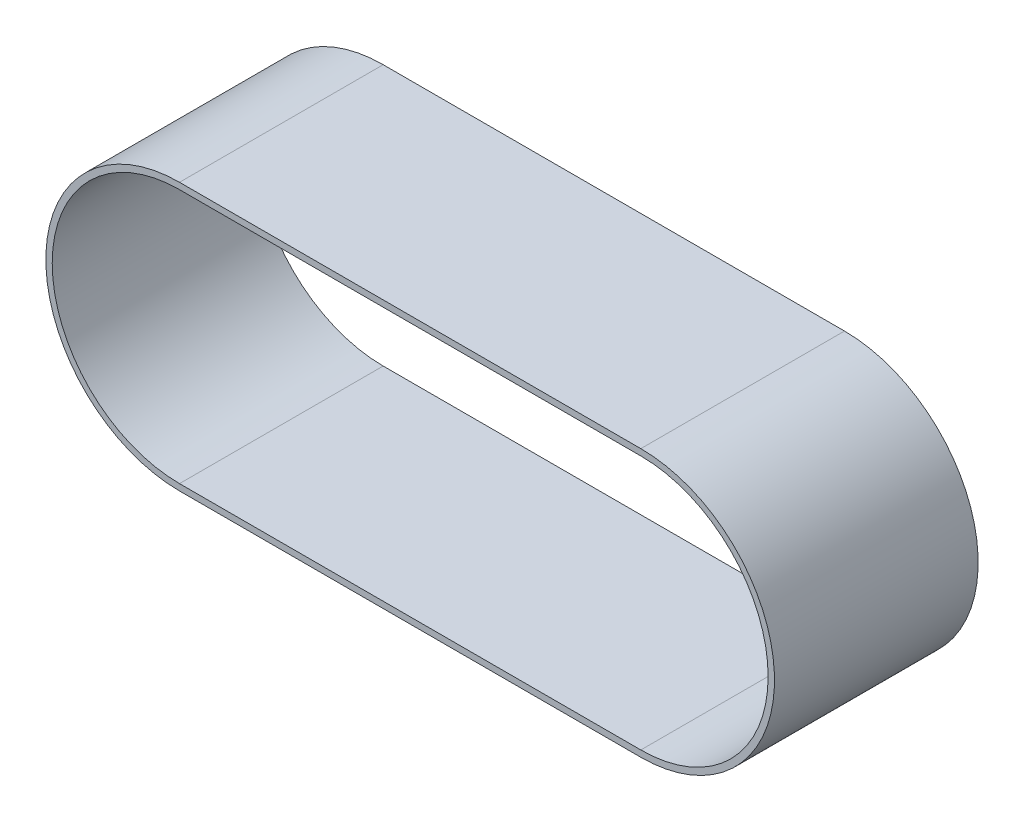
ISO-10303-21;
HEADER;
FILE_DESCRIPTION(('STEP AP214'),'2;1');
FILE_NAME('part.step','',(''),(''),'','','');
FILE_SCHEMA(('AUTOMOTIVE_DESIGN { 1 0 10303 214 1 1 1 1 }'));
ENDSEC;
DATA;
#1=APPLICATION_CONTEXT('core data for automotive mechanical design processes');
#2=APPLICATION_PROTOCOL_DEFINITION('international standard','automotive_design',2000,#1);
#3=PRODUCT_CONTEXT('',#1,'mechanical');
#4=PRODUCT('Part','Part','',(#3));
#5=PRODUCT_RELATED_PRODUCT_CATEGORY('part','',(#4));
#6=PRODUCT_DEFINITION_FORMATION('','',#4);
#7=PRODUCT_DEFINITION_CONTEXT('part definition',#1,'design');
#8=PRODUCT_DEFINITION('design','',#6,#7);
#9=PRODUCT_DEFINITION_SHAPE('','',#8);
#10=(LENGTH_UNIT() NAMED_UNIT(*) SI_UNIT(.MILLI.,.METRE.));
#11=(NAMED_UNIT(*) PLANE_ANGLE_UNIT() SI_UNIT($,.RADIAN.));
#12=(NAMED_UNIT(*) SI_UNIT($,.STERADIAN.) SOLID_ANGLE_UNIT());
#13=UNCERTAINTY_MEASURE_WITH_UNIT(LENGTH_MEASURE(1.E-05),#10,'distance_accuracy_value','');
#14=(GEOMETRIC_REPRESENTATION_CONTEXT(3) GLOBAL_UNCERTAINTY_ASSIGNED_CONTEXT((#13)) GLOBAL_UNIT_ASSIGNED_CONTEXT((#10,
#11,#12)) REPRESENTATION_CONTEXT('',''));
#15=CARTESIAN_POINT('',(0.,0.,0.));
#16=DIRECTION('',(0.,0.,1.));
#17=DIRECTION('',(1.,0.,0.));
#18=AXIS2_PLACEMENT_3D('',#15,#16,#17);
#19=CARTESIAN_POINT('',(0.,0.,50.8));
#20=DIRECTION('',(0.,0.,1.));
#21=DIRECTION('',(1.,0.,0.));
#22=AXIS2_PLACEMENT_3D('',#19,#20,#21);
#23=PLANE('',#22);
#24=CARTESIAN_POINT('',(0.,0.,50.8));
#25=DIRECTION('',(0.,0.,1.));
#26=DIRECTION('',(1.,0.,0.));
#27=AXIS2_PLACEMENT_3D('',#24,#25,#26);
#28=CIRCLE('',#27,33.3375);
#29=CARTESIAN_POINT('',(0.,33.3375,50.8));
#30=VERTEX_POINT('',#29);
#31=CARTESIAN_POINT('',(0.,-33.3375,50.8));
#32=VERTEX_POINT('',#31);
#33=EDGE_CURVE('E134',#30,#32,#28,.T.);
#34=ORIENTED_EDGE('',*,*,#33,.T.);
#35=DIRECTION('',(1.,0.,0.));
#36=VECTOR('',#35,1.);
#37=CARTESIAN_POINT('',(0.,-33.3375,50.8));
#38=LINE('',#37,#36);
#39=CARTESIAN_POINT('',(115.062,-33.3375,50.8));
#40=VERTEX_POINT('',#39);
#41=EDGE_CURVE('E137',#32,#40,#38,.T.);
#42=ORIENTED_EDGE('',*,*,#41,.T.);
#43=CARTESIAN_POINT('',(115.062,0.,50.8));
#44=DIRECTION('',(0.,0.,1.));
#45=DIRECTION('',(1.,0.,0.));
#46=AXIS2_PLACEMENT_3D('',#43,#44,#45);
#47=CIRCLE('',#46,33.3375);
#48=CARTESIAN_POINT('',(115.062,33.3375,50.8));
#49=VERTEX_POINT('',#48);
#50=EDGE_CURVE('E140',#40,#49,#47,.T.);
#51=ORIENTED_EDGE('',*,*,#50,.T.);
#52=DIRECTION('',(-1.,0.,0.));
#53=VECTOR('',#52,1.);
#54=CARTESIAN_POINT('',(0.,33.3375,50.8));
#55=LINE('',#54,#53);
#56=EDGE_CURVE('E142',#49,#30,#55,.T.);
#57=ORIENTED_EDGE('',*,*,#56,.T.);
#58=EDGE_LOOP('',(#34,#42,#51,#57));
#59=FACE_BOUND('',#58,.T.);
#60=DIRECTION('',(1.,0.,0.));
#61=VECTOR('',#60,1.);
#62=CARTESIAN_POINT('',(0.,-31.75,50.8));
#63=LINE('',#62,#61);
#64=CARTESIAN_POINT('',(0.,-31.75,50.8));
#65=VERTEX_POINT('',#64);
#66=CARTESIAN_POINT('',(115.062,-31.75,50.8));
#67=VERTEX_POINT('',#66);
#68=EDGE_CURVE('E106',#65,#67,#63,.T.);
#69=ORIENTED_EDGE('',*,*,#68,.F.);
#70=CARTESIAN_POINT('',(0.,0.,50.8));
#71=DIRECTION('',(0.,0.,1.));
#72=DIRECTION('',(1.,0.,0.));
#73=AXIS2_PLACEMENT_3D('',#70,#71,#72);
#74=CIRCLE('',#73,31.75);
#75=CARTESIAN_POINT('',(0.,31.75,50.8));
#76=VERTEX_POINT('',#75);
#77=EDGE_CURVE('E98',#76,#65,#74,.T.);
#78=ORIENTED_EDGE('',*,*,#77,.F.);
#79=DIRECTION('',(-1.,0.,0.));
#80=VECTOR('',#79,1.);
#81=CARTESIAN_POINT('',(0.,31.75,50.8));
#82=LINE('',#81,#80);
#83=CARTESIAN_POINT('',(115.062,31.75,50.8));
#84=VERTEX_POINT('',#83);
#85=EDGE_CURVE('E120',#84,#76,#82,.T.);
#86=ORIENTED_EDGE('',*,*,#85,.F.);
#87=CARTESIAN_POINT('',(115.062,0.,50.8));
#88=DIRECTION('',(0.,0.,1.));
#89=DIRECTION('',(1.,0.,0.));
#90=AXIS2_PLACEMENT_3D('',#87,#88,#89);
#91=CIRCLE('',#90,31.75);
#92=EDGE_CURVE('E118',#67,#84,#91,.T.);
#93=ORIENTED_EDGE('',*,*,#92,.F.);
#94=EDGE_LOOP('',(#69,#78,#86,#93));
#95=FACE_BOUND('',#94,.T.);
#96=ADVANCED_FACE('F33',(#59,#95),#23,.T.);
#97=CARTESIAN_POINT('',(0.,0.,0.));
#98=DIRECTION('',(0.,0.,1.));
#99=DIRECTION('',(1.,0.,0.));
#100=AXIS2_PLACEMENT_3D('',#97,#98,#99);
#101=PLANE('',#100);
#102=CARTESIAN_POINT('',(0.,0.,0.));
#103=DIRECTION('',(0.,0.,1.));
#104=DIRECTION('',(1.,0.,0.));
#105=AXIS2_PLACEMENT_3D('',#102,#103,#104);
#106=CIRCLE('',#105,33.3375);
#107=CARTESIAN_POINT('',(0.,33.3375,0.));
#108=VERTEX_POINT('',#107);
#109=CARTESIAN_POINT('',(0.,-33.3375,0.));
#110=VERTEX_POINT('',#109);
#111=EDGE_CURVE('E114',#108,#110,#106,.T.);
#112=ORIENTED_EDGE('',*,*,#111,.F.);
#113=DIRECTION('',(-1.,0.,0.));
#114=VECTOR('',#113,1.);
#115=CARTESIAN_POINT('',(0.,33.3375,0.));
#116=LINE('',#115,#114);
#117=CARTESIAN_POINT('',(115.062,33.3375,0.));
#118=VERTEX_POINT('',#117);
#119=EDGE_CURVE('E138',#118,#108,#116,.T.);
#120=ORIENTED_EDGE('',*,*,#119,.F.);
#121=CARTESIAN_POINT('',(115.062,0.,0.));
#122=DIRECTION('',(0.,0.,1.));
#123=DIRECTION('',(1.,0.,0.));
#124=AXIS2_PLACEMENT_3D('',#121,#122,#123);
#125=CIRCLE('',#124,33.3375);
#126=CARTESIAN_POINT('',(115.062,-33.3375,0.));
#127=VERTEX_POINT('',#126);
#128=EDGE_CURVE('E149',#127,#118,#125,.T.);
#129=ORIENTED_EDGE('',*,*,#128,.F.);
#130=DIRECTION('',(1.,0.,0.));
#131=VECTOR('',#130,1.);
#132=CARTESIAN_POINT('',(0.,-33.3375,0.));
#133=LINE('',#132,#131);
#134=EDGE_CURVE('E147',#110,#127,#133,.T.);
#135=ORIENTED_EDGE('',*,*,#134,.F.);
#136=EDGE_LOOP('',(#112,#120,#129,#135));
#137=FACE_BOUND('',#136,.T.);
#138=CARTESIAN_POINT('',(0.,0.,0.));
#139=DIRECTION('',(0.,0.,1.));
#140=DIRECTION('',(1.,0.,0.));
#141=AXIS2_PLACEMENT_3D('',#138,#139,#140);
#142=CIRCLE('',#141,31.75);
#143=CARTESIAN_POINT('',(0.,31.75,0.));
#144=VERTEX_POINT('',#143);
#145=CARTESIAN_POINT('',(0.,-31.75,0.));
#146=VERTEX_POINT('',#145);
#147=EDGE_CURVE('E56',#144,#146,#142,.T.);
#148=ORIENTED_EDGE('',*,*,#147,.T.);
#149=DIRECTION('',(1.,0.,0.));
#150=VECTOR('',#149,1.);
#151=CARTESIAN_POINT('',(0.,-31.75,0.));
#152=LINE('',#151,#150);
#153=CARTESIAN_POINT('',(115.062,-31.75,0.));
#154=VERTEX_POINT('',#153);
#155=EDGE_CURVE('E113',#146,#154,#152,.T.);
#156=ORIENTED_EDGE('',*,*,#155,.T.);
#157=CARTESIAN_POINT('',(115.062,0.,0.));
#158=DIRECTION('',(0.,0.,1.));
#159=DIRECTION('',(1.,0.,0.));
#160=AXIS2_PLACEMENT_3D('',#157,#158,#159);
#161=CIRCLE('',#160,31.75);
#162=CARTESIAN_POINT('',(115.062,31.75,0.));
#163=VERTEX_POINT('',#162);
#164=EDGE_CURVE('E126',#154,#163,#161,.T.);
#165=ORIENTED_EDGE('',*,*,#164,.T.);
#166=DIRECTION('',(-1.,0.,0.));
#167=VECTOR('',#166,1.);
#168=CARTESIAN_POINT('',(0.,31.75,0.));
#169=LINE('',#168,#167);
#170=EDGE_CURVE('E107',#163,#144,#169,.T.);
#171=ORIENTED_EDGE('',*,*,#170,.T.);
#172=EDGE_LOOP('',(#148,#156,#165,#171));
#173=FACE_BOUND('',#172,.T.);
#174=ADVANCED_FACE('F167',(#137,#173),#101,.F.);
#175=CARTESIAN_POINT('',(0.,0.,50.8));
#176=DIRECTION('',(0.,0.,-1.));
#177=DIRECTION('',(-1.,0.,0.));
#178=AXIS2_PLACEMENT_3D('',#175,#176,#177);
#179=CYLINDRICAL_SURFACE('',#178,33.3375);
#180=ORIENTED_EDGE('',*,*,#111,.T.);
#181=DIRECTION('',(0.,0.,-1.));
#182=VECTOR('',#181,1.);
#183=CARTESIAN_POINT('',(0.,-33.3375,50.8));
#184=LINE('',#183,#182);
#185=EDGE_CURVE('E11',#32,#110,#184,.T.);
#186=ORIENTED_EDGE('',*,*,#185,.F.);
#187=ORIENTED_EDGE('',*,*,#33,.F.);
#188=DIRECTION('',(0.,0.,-1.));
#189=VECTOR('',#188,1.);
#190=CARTESIAN_POINT('',(0.,33.3375,50.8));
#191=LINE('',#190,#189);
#192=EDGE_CURVE('E144',#30,#108,#191,.T.);
#193=ORIENTED_EDGE('',*,*,#192,.T.);
#194=EDGE_LOOP('',(#180,#186,#187,#193));
#195=FACE_BOUND('',#194,.T.);
#196=ADVANCED_FACE('F35',(#195),#179,.T.);
#197=CARTESIAN_POINT('',(0.,-33.3375,50.8));
#198=DIRECTION('',(0.,1.,0.));
#199=DIRECTION('',(0.,0.,1.));
#200=AXIS2_PLACEMENT_3D('',#197,#198,#199);
#201=PLANE('',#200);
#202=ORIENTED_EDGE('',*,*,#134,.T.);
#203=DIRECTION('',(0.,0.,-1.));
#204=VECTOR('',#203,1.);
#205=CARTESIAN_POINT('',(115.062,-33.3375,50.8));
#206=LINE('',#205,#204);
#207=EDGE_CURVE('E41',#40,#127,#206,.T.);
#208=ORIENTED_EDGE('',*,*,#207,.F.);
#209=ORIENTED_EDGE('',*,*,#41,.F.);
#210=ORIENTED_EDGE('',*,*,#185,.T.);
#211=EDGE_LOOP('',(#202,#208,#209,#210));
#212=FACE_BOUND('',#211,.T.);
#213=ADVANCED_FACE('F177',(#212),#201,.F.);
#214=CARTESIAN_POINT('',(115.062,0.,50.8));
#215=DIRECTION('',(0.,0.,-1.));
#216=DIRECTION('',(-1.,0.,0.));
#217=AXIS2_PLACEMENT_3D('',#214,#215,#216);
#218=CYLINDRICAL_SURFACE('',#217,33.3375);
#219=ORIENTED_EDGE('',*,*,#128,.T.);
#220=DIRECTION('',(0.,0.,-1.));
#221=VECTOR('',#220,1.);
#222=CARTESIAN_POINT('',(115.062,33.3375,50.8));
#223=LINE('',#222,#221);
#224=EDGE_CURVE('E154',#49,#118,#223,.T.);
#225=ORIENTED_EDGE('',*,*,#224,.F.);
#226=ORIENTED_EDGE('',*,*,#50,.F.);
#227=ORIENTED_EDGE('',*,*,#207,.T.);
#228=EDGE_LOOP('',(#219,#225,#226,#227));
#229=FACE_BOUND('',#228,.T.);
#230=ADVANCED_FACE('F161',(#229),#218,.T.);
#231=CARTESIAN_POINT('',(0.,33.3375,50.8));
#232=DIRECTION('',(0.,-1.,0.));
#233=DIRECTION('',(0.,0.,-1.));
#234=AXIS2_PLACEMENT_3D('',#231,#232,#233);
#235=PLANE('',#234);
#236=ORIENTED_EDGE('',*,*,#119,.T.);
#237=ORIENTED_EDGE('',*,*,#192,.F.);
#238=ORIENTED_EDGE('',*,*,#56,.F.);
#239=ORIENTED_EDGE('',*,*,#224,.T.);
#240=EDGE_LOOP('',(#236,#237,#238,#239));
#241=FACE_BOUND('',#240,.T.);
#242=ADVANCED_FACE('F171',(#241),#235,.F.);
#243=CARTESIAN_POINT('',(0.,0.,50.8));
#244=DIRECTION('',(0.,0.,-1.));
#245=DIRECTION('',(-1.,0.,0.));
#246=AXIS2_PLACEMENT_3D('',#243,#244,#245);
#247=CYLINDRICAL_SURFACE('',#246,31.75);
#248=ORIENTED_EDGE('',*,*,#147,.F.);
#249=DIRECTION('',(0.,0.,-1.));
#250=VECTOR('',#249,1.);
#251=CARTESIAN_POINT('',(0.,31.75,50.8));
#252=LINE('',#251,#250);
#253=EDGE_CURVE('E102',#76,#144,#252,.T.);
#254=ORIENTED_EDGE('',*,*,#253,.F.);
#255=ORIENTED_EDGE('',*,*,#77,.T.);
#256=DIRECTION('',(0.,0.,-1.));
#257=VECTOR('',#256,1.);
#258=CARTESIAN_POINT('',(0.,-31.75,50.8));
#259=LINE('',#258,#257);
#260=EDGE_CURVE('E101',#65,#146,#259,.T.);
#261=ORIENTED_EDGE('',*,*,#260,.T.);
#262=EDGE_LOOP('',(#248,#254,#255,#261));
#263=FACE_BOUND('',#262,.T.);
#264=ADVANCED_FACE('F100',(#263),#247,.F.);
#265=CARTESIAN_POINT('',(0.,-31.75,50.8));
#266=DIRECTION('',(0.,1.,0.));
#267=DIRECTION('',(0.,0.,1.));
#268=AXIS2_PLACEMENT_3D('',#265,#266,#267);
#269=PLANE('',#268);
#270=ORIENTED_EDGE('',*,*,#155,.F.);
#271=ORIENTED_EDGE('',*,*,#260,.F.);
#272=ORIENTED_EDGE('',*,*,#68,.T.);
#273=DIRECTION('',(0.,0.,-1.));
#274=VECTOR('',#273,1.);
#275=CARTESIAN_POINT('',(115.062,-31.75,50.8));
#276=LINE('',#275,#274);
#277=EDGE_CURVE('E115',#67,#154,#276,.T.);
#278=ORIENTED_EDGE('',*,*,#277,.T.);
#279=EDGE_LOOP('',(#270,#271,#272,#278));
#280=FACE_BOUND('',#279,.T.);
#281=ADVANCED_FACE('F110',(#280),#269,.T.);
#282=CARTESIAN_POINT('',(115.062,0.,50.8));
#283=DIRECTION('',(0.,0.,-1.));
#284=DIRECTION('',(-1.,0.,0.));
#285=AXIS2_PLACEMENT_3D('',#282,#283,#284);
#286=CYLINDRICAL_SURFACE('',#285,31.75);
#287=ORIENTED_EDGE('',*,*,#164,.F.);
#288=ORIENTED_EDGE('',*,*,#277,.F.);
#289=ORIENTED_EDGE('',*,*,#92,.T.);
#290=DIRECTION('',(0.,0.,-1.));
#291=VECTOR('',#290,1.);
#292=CARTESIAN_POINT('',(115.062,31.75,50.8));
#293=LINE('',#292,#291);
#294=EDGE_CURVE('E48',#84,#163,#293,.T.);
#295=ORIENTED_EDGE('',*,*,#294,.T.);
#296=EDGE_LOOP('',(#287,#288,#289,#295));
#297=FACE_BOUND('',#296,.T.);
#298=ADVANCED_FACE('F200',(#297),#286,.F.);
#299=CARTESIAN_POINT('',(0.,31.75,50.8));
#300=DIRECTION('',(0.,-1.,0.));
#301=DIRECTION('',(0.,0.,-1.));
#302=AXIS2_PLACEMENT_3D('',#299,#300,#301);
#303=PLANE('',#302);
#304=ORIENTED_EDGE('',*,*,#170,.F.);
#305=ORIENTED_EDGE('',*,*,#294,.F.);
#306=ORIENTED_EDGE('',*,*,#85,.T.);
#307=ORIENTED_EDGE('',*,*,#253,.T.);
#308=EDGE_LOOP('',(#304,#305,#306,#307));
#309=FACE_BOUND('',#308,.T.);
#310=ADVANCED_FACE('F204',(#309),#303,.T.);
#311=CLOSED_SHELL('',(#96,#174,#196,#213,#230,#242,#264,#281,#298,#310));
#312=MANIFOLD_SOLID_BREP('B2',#311);
#313=ADVANCED_BREP_SHAPE_REPRESENTATION('',(#18,#312),#14);
#314=SHAPE_DEFINITION_REPRESENTATION(#9,#313);
ENDSEC;
END-ISO-10303-21;
